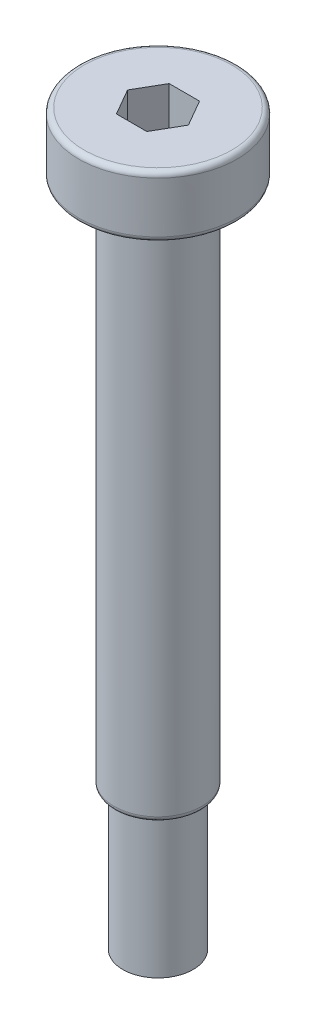
ISO-10303-21;
HEADER;
FILE_DESCRIPTION(('STEP AP214'),'2;1');
FILE_NAME('part.step','',(''),(''),'','','');
FILE_SCHEMA(('AUTOMOTIVE_DESIGN { 1 0 10303 214 1 1 1 1 }'));
ENDSEC;
DATA;
#1=APPLICATION_CONTEXT('core data for automotive mechanical design processes');
#2=APPLICATION_PROTOCOL_DEFINITION('international standard','automotive_design',2000,#1);
#3=PRODUCT_CONTEXT('',#1,'mechanical');
#4=PRODUCT('Part','Part','',(#3));
#5=PRODUCT_RELATED_PRODUCT_CATEGORY('part','',(#4));
#6=PRODUCT_DEFINITION_FORMATION('','',#4);
#7=PRODUCT_DEFINITION_CONTEXT('part definition',#1,'design');
#8=PRODUCT_DEFINITION('design','',#6,#7);
#9=PRODUCT_DEFINITION_SHAPE('','',#8);
#10=(LENGTH_UNIT() NAMED_UNIT(*) SI_UNIT(.MILLI.,.METRE.));
#11=(NAMED_UNIT(*) PLANE_ANGLE_UNIT() SI_UNIT($,.RADIAN.));
#12=(NAMED_UNIT(*) SI_UNIT($,.STERADIAN.) SOLID_ANGLE_UNIT());
#13=UNCERTAINTY_MEASURE_WITH_UNIT(LENGTH_MEASURE(1.E-05),#10,'distance_accuracy_value','');
#14=(GEOMETRIC_REPRESENTATION_CONTEXT(3) GLOBAL_UNCERTAINTY_ASSIGNED_CONTEXT((#13)) GLOBAL_UNIT_ASSIGNED_CONTEXT((#10,
#11,#12)) REPRESENTATION_CONTEXT('',''));
#15=CARTESIAN_POINT('',(0.,0.,0.));
#16=DIRECTION('',(0.,0.,1.));
#17=DIRECTION('',(1.,0.,0.));
#18=AXIS2_PLACEMENT_3D('',#15,#16,#17);
#19=CARTESIAN_POINT('',(0.,0.,0.));
#20=DIRECTION('',(0.,-1.,0.));
#21=DIRECTION('',(1.,0.,0.));
#22=AXIS2_PLACEMENT_3D('',#19,#20,#21);
#23=PLANE('',#22);
#24=CARTESIAN_POINT('',(0.,0.,0.));
#25=DIRECTION('',(0.,1.,0.));
#26=DIRECTION('',(-1.,0.,0.));
#27=AXIS2_PLACEMENT_3D('',#24,#25,#26);
#28=CIRCLE('',#27,2.);
#29=CARTESIAN_POINT('',(-2.,0.,0.));
#30=VERTEX_POINT('',#29);
#31=EDGE_CURVE('E154',#30,#30,#28,.T.);
#32=ORIENTED_EDGE('',*,*,#31,.F.);
#33=EDGE_LOOP('',(#32));
#34=FACE_BOUND('',#33,.T.);
#35=ADVANCED_FACE('F41',(#34),#23,.T.);
#36=CARTESIAN_POINT('',(0.,41.5,0.));
#37=DIRECTION('',(0.,1.,0.));
#38=DIRECTION('',(-1.,0.,0.));
#39=AXIS2_PLACEMENT_3D('',#36,#37,#38);
#40=CYLINDRICAL_SURFACE('',#39,2.);
#41=ORIENTED_EDGE('',*,*,#31,.T.);
#42=EDGE_LOOP('',(#41));
#43=FACE_BOUND('',#42,.T.);
#44=CARTESIAN_POINT('',(0.,8.,0.));
#45=DIRECTION('',(0.,1.,0.));
#46=DIRECTION('',(-1.,0.,0.));
#47=AXIS2_PLACEMENT_3D('',#44,#45,#46);
#48=CIRCLE('',#47,1.99999999999999);
#49=CARTESIAN_POINT('',(-2.,8.,0.));
#50=VERTEX_POINT('',#49);
#51=EDGE_CURVE('E151',#50,#50,#48,.T.);
#52=ORIENTED_EDGE('',*,*,#51,.F.);
#53=EDGE_LOOP('',(#52));
#54=FACE_BOUND('',#53,.T.);
#55=ADVANCED_FACE('F198',(#43,#54),#40,.T.);
#56=CARTESIAN_POINT('',(-2.,8.,0.));
#57=DIRECTION('',(0.,-1.,0.));
#58=DIRECTION('',(1.,0.,0.));
#59=AXIS2_PLACEMENT_3D('',#56,#57,#58);
#60=PLANE('',#59);
#61=CARTESIAN_POINT('',(0.,8.,0.));
#62=DIRECTION('',(0.,-1.,0.));
#63=DIRECTION('',(1.,0.,0.));
#64=AXIS2_PLACEMENT_3D('',#61,#62,#63);
#65=CIRCLE('',#64,2.19999999999999);
#66=CARTESIAN_POINT('',(2.19999999999999,8.,0.));
#67=VERTEX_POINT('',#66);
#68=EDGE_CURVE('E49',#67,#67,#65,.T.);
#69=ORIENTED_EDGE('',*,*,#68,.T.);
#70=EDGE_LOOP('',(#69));
#71=FACE_BOUND('',#70,.T.);
#72=ORIENTED_EDGE('',*,*,#51,.T.);
#73=EDGE_LOOP('',(#72));
#74=FACE_BOUND('',#73,.T.);
#75=ADVANCED_FACE('F171',(#71,#74),#60,.T.);
#76=CARTESIAN_POINT('',(0.,41.5,0.));
#77=DIRECTION('',(0.,1.,0.));
#78=DIRECTION('',(-1.,0.,0.));
#79=AXIS2_PLACEMENT_3D('',#76,#77,#78);
#80=CYLINDRICAL_SURFACE('',#79,2.49999999999999);
#81=CARTESIAN_POINT('',(0.,8.3,0.));
#82=DIRECTION('',(0.,-1.,0.));
#83=DIRECTION('',(1.,0.,0.));
#84=AXIS2_PLACEMENT_3D('',#81,#82,#83);
#85=CIRCLE('',#84,2.49999999999999);
#86=CARTESIAN_POINT('',(2.49999999999999,8.3,0.));
#87=VERTEX_POINT('',#86);
#88=EDGE_CURVE('E166',#87,#87,#85,.F.);
#89=ORIENTED_EDGE('',*,*,#88,.T.);
#90=EDGE_LOOP('',(#89));
#91=FACE_BOUND('',#90,.T.);
#92=CARTESIAN_POINT('',(0.,38.,0.));
#93=DIRECTION('',(0.,1.,0.));
#94=DIRECTION('',(-1.,0.,0.));
#95=AXIS2_PLACEMENT_3D('',#92,#93,#94);
#96=CIRCLE('',#95,2.49999999999999);
#97=CARTESIAN_POINT('',(-2.5,38.,0.));
#98=VERTEX_POINT('',#97);
#99=EDGE_CURVE('E143',#98,#98,#96,.T.);
#100=ORIENTED_EDGE('',*,*,#99,.F.);
#101=EDGE_LOOP('',(#100));
#102=FACE_BOUND('',#101,.T.);
#103=ADVANCED_FACE('F180',(#91,#102),#80,.T.);
#104=CARTESIAN_POINT('',(-2.5,38.,0.));
#105=DIRECTION('',(0.,-1.,0.));
#106=DIRECTION('',(1.,0.,0.));
#107=AXIS2_PLACEMENT_3D('',#104,#105,#106);
#108=PLANE('',#107);
#109=CARTESIAN_POINT('',(0.,38.,0.));
#110=DIRECTION('',(0.,-1.,0.));
#111=DIRECTION('',(1.,0.,0.));
#112=AXIS2_PLACEMENT_3D('',#109,#110,#111);
#113=CIRCLE('',#112,4.19999999999999);
#114=CARTESIAN_POINT('',(4.19999999999999,38.,0.));
#115=VERTEX_POINT('',#114);
#116=EDGE_CURVE('E11',#115,#115,#113,.T.);
#117=ORIENTED_EDGE('',*,*,#116,.T.);
#118=EDGE_LOOP('',(#117));
#119=FACE_BOUND('',#118,.T.);
#120=ORIENTED_EDGE('',*,*,#99,.T.);
#121=EDGE_LOOP('',(#120));
#122=FACE_BOUND('',#121,.T.);
#123=ADVANCED_FACE('F183',(#119,#122),#108,.T.);
#124=CARTESIAN_POINT('',(0.,41.5,0.));
#125=DIRECTION('',(0.,1.,0.));
#126=DIRECTION('',(-1.,0.,0.));
#127=AXIS2_PLACEMENT_3D('',#124,#125,#126);
#128=CYLINDRICAL_SURFACE('',#127,4.49999999999999);
#129=CARTESIAN_POINT('',(0.,41.2,0.));
#130=DIRECTION('',(0.,1.,0.));
#131=DIRECTION('',(-1.,0.,0.));
#132=AXIS2_PLACEMENT_3D('',#129,#130,#131);
#133=CIRCLE('',#132,4.49999999999999);
#134=CARTESIAN_POINT('',(-4.5,41.2,0.));
#135=VERTEX_POINT('',#134);
#136=EDGE_CURVE('E163',#135,#135,#133,.F.);
#137=ORIENTED_EDGE('',*,*,#136,.T.);
#138=EDGE_LOOP('',(#137));
#139=FACE_BOUND('',#138,.T.);
#140=CARTESIAN_POINT('',(0.,38.3,0.));
#141=DIRECTION('',(0.,-1.,0.));
#142=DIRECTION('',(1.,0.,0.));
#143=AXIS2_PLACEMENT_3D('',#140,#141,#142);
#144=CIRCLE('',#143,4.49999999999999);
#145=CARTESIAN_POINT('',(4.49999999999999,38.3,0.));
#146=VERTEX_POINT('',#145);
#147=EDGE_CURVE('E160',#146,#146,#144,.F.);
#148=ORIENTED_EDGE('',*,*,#147,.T.);
#149=EDGE_LOOP('',(#148));
#150=FACE_BOUND('',#149,.T.);
#151=ADVANCED_FACE('F188',(#139,#150),#128,.T.);
#152=CARTESIAN_POINT('',(-4.5,41.5,0.));
#153=DIRECTION('',(0.,1.,0.));
#154=DIRECTION('',(-1.,0.,0.));
#155=AXIS2_PLACEMENT_3D('',#152,#153,#154);
#156=PLANE('',#155);
#157=DIRECTION('',(1.,0.,0.));
#158=VECTOR('',#157,1.);
#159=CARTESIAN_POINT('',(-0.866025403784445,41.5,1.5));
#160=LINE('',#159,#158);
#161=CARTESIAN_POINT('',(-0.866025403784445,41.5,1.5));
#162=VERTEX_POINT('',#161);
#163=CARTESIAN_POINT('',(0.866025403784433,41.5,1.5));
#164=VERTEX_POINT('',#163);
#165=EDGE_CURVE('E56',#162,#164,#160,.T.);
#166=ORIENTED_EDGE('',*,*,#165,.F.);
#167=DIRECTION('',(0.5,0.,0.866025403784438));
#168=VECTOR('',#167,1.);
#169=CARTESIAN_POINT('',(-1.73205080756888,41.5,0.));
#170=LINE('',#169,#168);
#171=CARTESIAN_POINT('',(-1.73205080756888,41.5,0.));
#172=VERTEX_POINT('',#171);
#173=EDGE_CURVE('E139',#172,#162,#170,.T.);
#174=ORIENTED_EDGE('',*,*,#173,.F.);
#175=DIRECTION('',(-0.5,0.,0.866025403784439));
#176=VECTOR('',#175,1.);
#177=CARTESIAN_POINT('',(-0.866025403784445,41.5,-1.5));
#178=LINE('',#177,#176);
#179=CARTESIAN_POINT('',(-0.866025403784445,41.5,-1.5));
#180=VERTEX_POINT('',#179);
#181=EDGE_CURVE('E137',#180,#172,#178,.T.);
#182=ORIENTED_EDGE('',*,*,#181,.F.);
#183=DIRECTION('',(-1.,0.,0.));
#184=VECTOR('',#183,1.);
#185=CARTESIAN_POINT('',(0.866025403784431,41.5,-1.5));
#186=LINE('',#185,#184);
#187=CARTESIAN_POINT('',(0.866025403784431,41.5,-1.5));
#188=VERTEX_POINT('',#187);
#189=EDGE_CURVE('E104',#188,#180,#186,.T.);
#190=ORIENTED_EDGE('',*,*,#189,.F.);
#191=DIRECTION('',(-0.5,0.,-0.866025403784438));
#192=VECTOR('',#191,1.);
#193=CARTESIAN_POINT('',(1.73205080756887,41.5,0.));
#194=LINE('',#193,#192);
#195=CARTESIAN_POINT('',(1.73205080756887,41.5,0.));
#196=VERTEX_POINT('',#195);
#197=EDGE_CURVE('E133',#196,#188,#194,.T.);
#198=ORIENTED_EDGE('',*,*,#197,.F.);
#199=DIRECTION('',(0.5,0.,-0.866025403784439));
#200=VECTOR('',#199,1.);
#201=CARTESIAN_POINT('',(0.866025403784432,41.5,1.5));
#202=LINE('',#201,#200);
#203=EDGE_CURVE('E130',#164,#196,#202,.T.);
#204=ORIENTED_EDGE('',*,*,#203,.F.);
#205=EDGE_LOOP('',(#166,#174,#182,#190,#198,#204));
#206=FACE_BOUND('',#205,.T.);
#207=CARTESIAN_POINT('',(0.,41.5,0.));
#208=DIRECTION('',(0.,1.,0.));
#209=DIRECTION('',(-1.,0.,0.));
#210=AXIS2_PLACEMENT_3D('',#207,#208,#209);
#211=CIRCLE('',#210,4.19999999999999);
#212=CARTESIAN_POINT('',(-4.2,41.5,0.));
#213=VERTEX_POINT('',#212);
#214=EDGE_CURVE('E157',#213,#213,#211,.T.);
#215=ORIENTED_EDGE('',*,*,#214,.T.);
#216=EDGE_LOOP('',(#215));
#217=FACE_BOUND('',#216,.T.);
#218=ADVANCED_FACE('F194',(#206,#217),#156,.T.);
#219=CARTESIAN_POINT('',(0.,41.2,0.));
#220=DIRECTION('',(0.,1.,0.));
#221=DIRECTION('',(-1.,0.,0.));
#222=AXIS2_PLACEMENT_3D('',#219,#220,#221);
#223=TOROIDAL_SURFACE('',#222,4.19999999999999,0.3);
#224=ORIENTED_EDGE('',*,*,#136,.F.);
#225=EDGE_LOOP('',(#224));
#226=FACE_BOUND('',#225,.T.);
#227=ORIENTED_EDGE('',*,*,#214,.F.);
#228=EDGE_LOOP('',(#227));
#229=FACE_BOUND('',#228,.T.);
#230=ADVANCED_FACE('F177',(#226,#229),#223,.T.);
#231=CARTESIAN_POINT('',(0.,8.3,0.));
#232=DIRECTION('',(0.,-1.,0.));
#233=DIRECTION('',(1.,0.,0.));
#234=AXIS2_PLACEMENT_3D('',#231,#232,#233);
#235=TOROIDAL_SURFACE('',#234,2.19999999999999,0.3);
#236=ORIENTED_EDGE('',*,*,#68,.F.);
#237=EDGE_LOOP('',(#236));
#238=FACE_BOUND('',#237,.T.);
#239=ORIENTED_EDGE('',*,*,#88,.F.);
#240=EDGE_LOOP('',(#239));
#241=FACE_BOUND('',#240,.T.);
#242=ADVANCED_FACE('F174',(#238,#241),#235,.T.);
#243=CARTESIAN_POINT('',(0.,38.3,0.));
#244=DIRECTION('',(0.,-1.,0.));
#245=DIRECTION('',(1.,0.,0.));
#246=AXIS2_PLACEMENT_3D('',#243,#244,#245);
#247=TOROIDAL_SURFACE('',#246,4.19999999999999,0.3);
#248=ORIENTED_EDGE('',*,*,#116,.F.);
#249=EDGE_LOOP('',(#248));
#250=FACE_BOUND('',#249,.T.);
#251=ORIENTED_EDGE('',*,*,#147,.F.);
#252=EDGE_LOOP('',(#251));
#253=FACE_BOUND('',#252,.T.);
#254=ADVANCED_FACE('F43',(#250,#253),#247,.T.);
#255=CARTESIAN_POINT('',(-0.866025403784445,39.1,1.5));
#256=DIRECTION('',(0.,0.,1.));
#257=DIRECTION('',(1.,0.,0.));
#258=AXIS2_PLACEMENT_3D('',#255,#256,#257);
#259=PLANE('',#258);
#260=ORIENTED_EDGE('',*,*,#165,.T.);
#261=DIRECTION('',(0.,1.,0.));
#262=VECTOR('',#261,1.);
#263=CARTESIAN_POINT('',(0.866025403784432,39.1,1.5));
#264=LINE('',#263,#262);
#265=CARTESIAN_POINT('',(0.866025403784432,39.1,1.5));
#266=VERTEX_POINT('',#265);
#267=EDGE_CURVE('E86',#266,#164,#264,.T.);
#268=ORIENTED_EDGE('',*,*,#267,.F.);
#269=DIRECTION('',(1.,0.,0.));
#270=VECTOR('',#269,1.);
#271=CARTESIAN_POINT('',(-0.866025403784445,39.1,1.5));
#272=LINE('',#271,#270);
#273=CARTESIAN_POINT('',(-0.866025403784445,39.1,1.5));
#274=VERTEX_POINT('',#273);
#275=EDGE_CURVE('E141',#274,#266,#272,.T.);
#276=ORIENTED_EDGE('',*,*,#275,.F.);
#277=DIRECTION('',(0.,1.,0.));
#278=VECTOR('',#277,1.);
#279=CARTESIAN_POINT('',(-0.866025403784445,39.1,1.5));
#280=LINE('',#279,#278);
#281=EDGE_CURVE('E64',#274,#162,#280,.T.);
#282=ORIENTED_EDGE('',*,*,#281,.T.);
#283=EDGE_LOOP('',(#260,#268,#276,#282));
#284=FACE_BOUND('',#283,.T.);
#285=ADVANCED_FACE('F224',(#284),#259,.F.);
#286=CARTESIAN_POINT('',(-1.73205080756888,39.1,0.));
#287=DIRECTION('',(-0.866025403784438,0.,0.5));
#288=DIRECTION('',(0.5,0.,0.866025403784438));
#289=AXIS2_PLACEMENT_3D('',#286,#287,#288);
#290=PLANE('',#289);
#291=ORIENTED_EDGE('',*,*,#173,.T.);
#292=ORIENTED_EDGE('',*,*,#281,.F.);
#293=DIRECTION('',(0.5,0.,0.866025403784438));
#294=VECTOR('',#293,1.);
#295=CARTESIAN_POINT('',(-1.73205080756888,39.1,0.));
#296=LINE('',#295,#294);
#297=CARTESIAN_POINT('',(-1.73205080756888,39.1,0.));
#298=VERTEX_POINT('',#297);
#299=EDGE_CURVE('E116',#298,#274,#296,.T.);
#300=ORIENTED_EDGE('',*,*,#299,.F.);
#301=DIRECTION('',(0.,1.,0.));
#302=VECTOR('',#301,1.);
#303=CARTESIAN_POINT('',(-1.73205080756888,39.1,0.));
#304=LINE('',#303,#302);
#305=EDGE_CURVE('E108',#298,#172,#304,.T.);
#306=ORIENTED_EDGE('',*,*,#305,.T.);
#307=EDGE_LOOP('',(#291,#292,#300,#306));
#308=FACE_BOUND('',#307,.T.);
#309=ADVANCED_FACE('F229',(#308),#290,.F.);
#310=CARTESIAN_POINT('',(-0.866025403784445,39.1,-1.5));
#311=DIRECTION('',(-0.866025403784439,0.,-0.5));
#312=DIRECTION('',(-0.5,0.,0.866025403784439));
#313=AXIS2_PLACEMENT_3D('',#310,#311,#312);
#314=PLANE('',#313);
#315=ORIENTED_EDGE('',*,*,#181,.T.);
#316=ORIENTED_EDGE('',*,*,#305,.F.);
#317=DIRECTION('',(-0.5,0.,0.866025403784439));
#318=VECTOR('',#317,1.);
#319=CARTESIAN_POINT('',(-0.866025403784445,39.1,-1.5));
#320=LINE('',#319,#318);
#321=CARTESIAN_POINT('',(-0.866025403784445,39.1,-1.5));
#322=VERTEX_POINT('',#321);
#323=EDGE_CURVE('E112',#322,#298,#320,.T.);
#324=ORIENTED_EDGE('',*,*,#323,.F.);
#325=DIRECTION('',(0.,1.,0.));
#326=VECTOR('',#325,1.);
#327=CARTESIAN_POINT('',(-0.866025403784445,39.1,-1.5));
#328=LINE('',#327,#326);
#329=EDGE_CURVE('E97',#322,#180,#328,.T.);
#330=ORIENTED_EDGE('',*,*,#329,.T.);
#331=EDGE_LOOP('',(#315,#316,#324,#330));
#332=FACE_BOUND('',#331,.T.);
#333=ADVANCED_FACE('F113',(#332),#314,.F.);
#334=CARTESIAN_POINT('',(0.866025403784431,39.1,-1.5));
#335=DIRECTION('',(0.,0.,-1.));
#336=DIRECTION('',(-1.,0.,0.));
#337=AXIS2_PLACEMENT_3D('',#334,#335,#336);
#338=PLANE('',#337);
#339=ORIENTED_EDGE('',*,*,#189,.T.);
#340=ORIENTED_EDGE('',*,*,#329,.F.);
#341=DIRECTION('',(-1.,0.,0.));
#342=VECTOR('',#341,1.);
#343=CARTESIAN_POINT('',(0.866025403784431,39.1,-1.5));
#344=LINE('',#343,#342);
#345=CARTESIAN_POINT('',(0.866025403784431,39.1,-1.5));
#346=VERTEX_POINT('',#345);
#347=EDGE_CURVE('E101',#346,#322,#344,.T.);
#348=ORIENTED_EDGE('',*,*,#347,.F.);
#349=DIRECTION('',(0.,1.,0.));
#350=VECTOR('',#349,1.);
#351=CARTESIAN_POINT('',(0.866025403784431,39.1,-1.5));
#352=LINE('',#351,#350);
#353=EDGE_CURVE('E109',#346,#188,#352,.T.);
#354=ORIENTED_EDGE('',*,*,#353,.T.);
#355=EDGE_LOOP('',(#339,#340,#348,#354));
#356=FACE_BOUND('',#355,.T.);
#357=ADVANCED_FACE('F99',(#356),#338,.F.);
#358=CARTESIAN_POINT('',(1.73205080756887,39.1,0.));
#359=DIRECTION('',(0.866025403784438,0.,-0.5));
#360=DIRECTION('',(-0.5,0.,-0.866025403784439));
#361=AXIS2_PLACEMENT_3D('',#358,#359,#360);
#362=PLANE('',#361);
#363=ORIENTED_EDGE('',*,*,#197,.T.);
#364=ORIENTED_EDGE('',*,*,#353,.F.);
#365=DIRECTION('',(-0.5,0.,-0.866025403784438));
#366=VECTOR('',#365,1.);
#367=CARTESIAN_POINT('',(1.73205080756887,39.1,0.));
#368=LINE('',#367,#366);
#369=CARTESIAN_POINT('',(1.73205080756887,39.1,0.));
#370=VERTEX_POINT('',#369);
#371=EDGE_CURVE('E122',#370,#346,#368,.T.);
#372=ORIENTED_EDGE('',*,*,#371,.F.);
#373=DIRECTION('',(0.,1.,0.));
#374=VECTOR('',#373,1.);
#375=CARTESIAN_POINT('',(1.73205080756887,39.1,0.));
#376=LINE('',#375,#374);
#377=EDGE_CURVE('E146',#370,#196,#376,.T.);
#378=ORIENTED_EDGE('',*,*,#377,.T.);
#379=EDGE_LOOP('',(#363,#364,#372,#378));
#380=FACE_BOUND('',#379,.T.);
#381=ADVANCED_FACE('F240',(#380),#362,.F.);
#382=CARTESIAN_POINT('',(0.866025403784432,39.1,1.5));
#383=DIRECTION('',(0.866025403784439,0.,0.5));
#384=DIRECTION('',(0.5,0.,-0.866025403784439));
#385=AXIS2_PLACEMENT_3D('',#382,#383,#384);
#386=PLANE('',#385);
#387=ORIENTED_EDGE('',*,*,#203,.T.);
#388=ORIENTED_EDGE('',*,*,#377,.F.);
#389=DIRECTION('',(0.5,0.,-0.866025403784439));
#390=VECTOR('',#389,1.);
#391=CARTESIAN_POINT('',(0.866025403784432,39.1,1.5));
#392=LINE('',#391,#390);
#393=EDGE_CURVE('E124',#266,#370,#392,.T.);
#394=ORIENTED_EDGE('',*,*,#393,.F.);
#395=ORIENTED_EDGE('',*,*,#267,.T.);
#396=EDGE_LOOP('',(#387,#388,#394,#395));
#397=FACE_BOUND('',#396,.T.);
#398=ADVANCED_FACE('F237',(#397),#386,.F.);
#399=CARTESIAN_POINT('',(0.,39.1,0.));
#400=DIRECTION('',(0.,1.,0.));
#401=DIRECTION('',(0.,0.,1.));
#402=AXIS2_PLACEMENT_3D('',#399,#400,#401);
#403=PLANE('',#402);
#404=ORIENTED_EDGE('',*,*,#275,.T.);
#405=ORIENTED_EDGE('',*,*,#393,.T.);
#406=ORIENTED_EDGE('',*,*,#371,.T.);
#407=ORIENTED_EDGE('',*,*,#347,.T.);
#408=ORIENTED_EDGE('',*,*,#323,.T.);
#409=ORIENTED_EDGE('',*,*,#299,.T.);
#410=EDGE_LOOP('',(#404,#405,#406,#407,#408,#409));
#411=FACE_BOUND('',#410,.T.);
#412=ADVANCED_FACE('F119',(#411),#403,.T.);
#413=CLOSED_SHELL('',(#35,#55,#75,#103,#123,#151,#218,#230,#242,#254,#285,#309,#333,#357,#381,
#398,#412));
#414=MANIFOLD_SOLID_BREP('B2',#413);
#415=ADVANCED_BREP_SHAPE_REPRESENTATION('',(#18,#414),#14);
#416=SHAPE_DEFINITION_REPRESENTATION(#9,#415);
ENDSEC;
END-ISO-10303-21;
